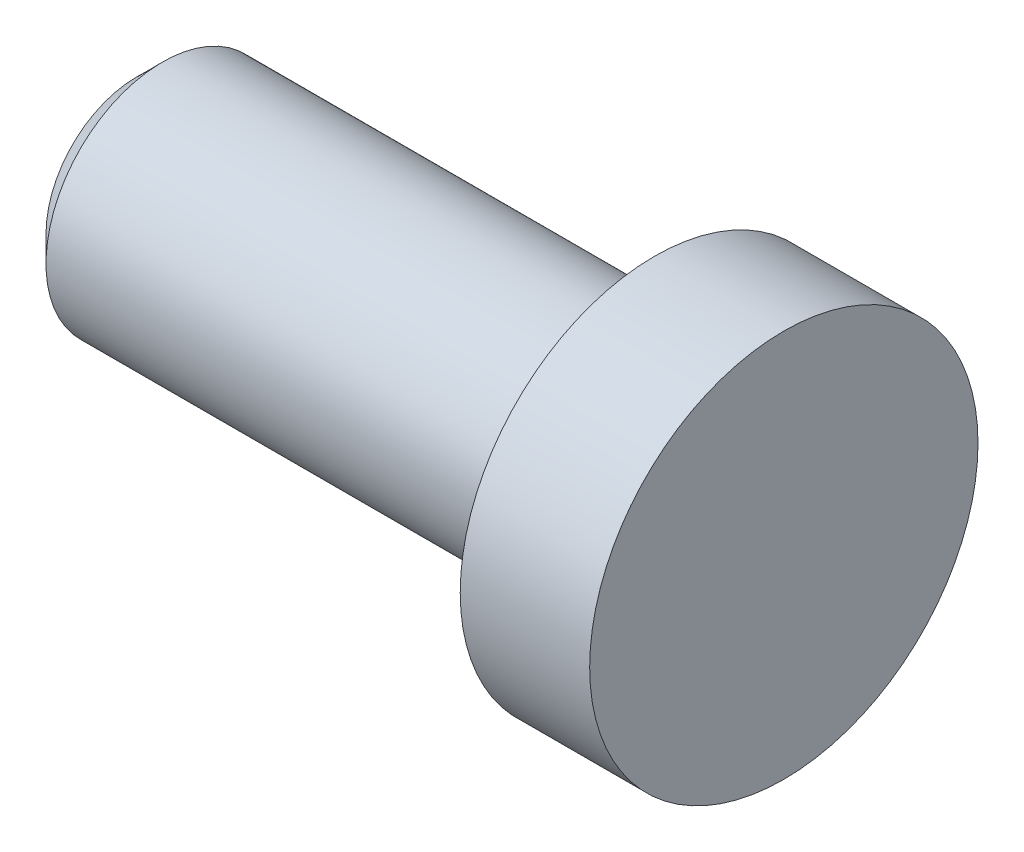
ISO-10303-21;
HEADER;
FILE_DESCRIPTION(('STEP AP214'),'2;1');
FILE_NAME('part.step','',(''),(''),'','','');
FILE_SCHEMA(('AUTOMOTIVE_DESIGN { 1 0 10303 214 1 1 1 1 }'));
ENDSEC;
DATA;
#1=APPLICATION_CONTEXT('core data for automotive mechanical design processes');
#2=APPLICATION_PROTOCOL_DEFINITION('international standard','automotive_design',2000,#1);
#3=PRODUCT_CONTEXT('',#1,'mechanical');
#4=PRODUCT('Part','Part','',(#3));
#5=PRODUCT_RELATED_PRODUCT_CATEGORY('part','',(#4));
#6=PRODUCT_DEFINITION_FORMATION('','',#4);
#7=PRODUCT_DEFINITION_CONTEXT('part definition',#1,'design');
#8=PRODUCT_DEFINITION('design','',#6,#7);
#9=PRODUCT_DEFINITION_SHAPE('','',#8);
#10=(LENGTH_UNIT() NAMED_UNIT(*) SI_UNIT(.MILLI.,.METRE.));
#11=(NAMED_UNIT(*) PLANE_ANGLE_UNIT() SI_UNIT($,.RADIAN.));
#12=(NAMED_UNIT(*) SI_UNIT($,.STERADIAN.) SOLID_ANGLE_UNIT());
#13=UNCERTAINTY_MEASURE_WITH_UNIT(LENGTH_MEASURE(1.E-05),#10,'distance_accuracy_value','');
#14=(GEOMETRIC_REPRESENTATION_CONTEXT(3) GLOBAL_UNCERTAINTY_ASSIGNED_CONTEXT((#13)) GLOBAL_UNIT_ASSIGNED_CONTEXT((#10,
#11,#12)) REPRESENTATION_CONTEXT('',''));
#15=CARTESIAN_POINT('',(0.,0.,0.));
#16=DIRECTION('',(0.,0.,1.));
#17=DIRECTION('',(1.,0.,0.));
#18=AXIS2_PLACEMENT_3D('',#15,#16,#17);
#19=CARTESIAN_POINT('',(-11.0000000000241,0.,0.));
#20=DIRECTION('',(-1.,0.,0.));
#21=DIRECTION('',(0.,0.,1.));
#22=AXIS2_PLACEMENT_3D('',#19,#20,#21);
#23=CONICAL_SURFACE('',#22,1.2499999999136,1.04719755103579);
#24=CARTESIAN_POINT('',(-11.,0.,0.));
#25=DIRECTION('',(-1.,0.,0.));
#26=DIRECTION('',(0.,0.,1.));
#27=AXIS2_PLACEMENT_3D('',#24,#25,#26);
#28=CIRCLE('',#27,1.25);
#29=CARTESIAN_POINT('',(-11.,0.,1.25));
#30=VERTEX_POINT('',#29);
#31=EDGE_CURVE('E89',#30,#30,#28,.T.);
#32=ORIENTED_EDGE('',*,*,#31,.T.);
#33=EDGE_LOOP('',(#32));
#34=FACE_BOUND('',#33,.T.);
#35=CARTESIAN_POINT('',(-10.2783121635071,1.98951966012828E-10,0.));
#36=VERTEX_POINT('',#35);
#37=VERTEX_LOOP('',#36);
#38=FACE_BOUND('',#37,.T.);
#39=ADVANCED_FACE('F16',(#34,#38),#23,.F.);
#40=CARTESIAN_POINT('',(-9.542227771689,0.,0.));
#41=DIRECTION('',(-1.,0.,0.));
#42=DIRECTION('',(0.,0.,1.));
#43=AXIS2_PLACEMENT_3D('',#40,#41,#42);
#44=CYLINDRICAL_SURFACE('',#43,1.25);
#45=CARTESIAN_POINT('',(-22.0500000000357,0.,0.));
#46=DIRECTION('',(-1.,0.,0.));
#47=DIRECTION('',(0.,1.,0.));
#48=AXIS2_PLACEMENT_3D('',#45,#46,#47);
#49=CIRCLE('',#48,1.25000000002728);
#50=CARTESIAN_POINT('',(-22.0500000000357,1.25000000002728,0.));
#51=VERTEX_POINT('',#50);
#52=EDGE_CURVE('E88',#51,#51,#49,.T.);
#53=ORIENTED_EDGE('',*,*,#52,.T.);
#54=EDGE_LOOP('',(#53));
#55=FACE_BOUND('',#54,.T.);
#56=ORIENTED_EDGE('',*,*,#31,.F.);
#57=EDGE_LOOP('',(#56));
#58=FACE_BOUND('',#57,.T.);
#59=ADVANCED_FACE('F28',(#55,#58),#44,.F.);
#60=CARTESIAN_POINT('',(-22.399999999891,0.,0.));
#61=DIRECTION('',(-1.,0.,0.));
#62=DIRECTION('',(0.,0.,1.));
#63=AXIS2_PLACEMENT_3D('',#60,#61,#62);
#64=CONICAL_SURFACE('',#63,1.59999999988258,0.785398163397448);
#65=CARTESIAN_POINT('',(-22.4,0.,0.));
#66=DIRECTION('',(-1.,0.,0.));
#67=DIRECTION('',(0.,0.,1.));
#68=AXIS2_PLACEMENT_3D('',#65,#66,#67);
#69=CIRCLE('',#68,1.6);
#70=CARTESIAN_POINT('',(-22.4,0.,1.6));
#71=VERTEX_POINT('',#70);
#72=EDGE_CURVE('E85',#71,#71,#69,.T.);
#73=ORIENTED_EDGE('',*,*,#72,.T.);
#74=EDGE_LOOP('',(#73));
#75=FACE_BOUND('',#74,.T.);
#76=ORIENTED_EDGE('',*,*,#52,.F.);
#77=EDGE_LOOP('',(#76));
#78=FACE_BOUND('',#77,.T.);
#79=ADVANCED_FACE('F34',(#75,#78),#64,.F.);
#80=CARTESIAN_POINT('',(-9.542227771689,0.,0.));
#81=DIRECTION('',(-1.,0.,0.));
#82=DIRECTION('',(0.,0.,1.));
#83=AXIS2_PLACEMENT_3D('',#80,#81,#82);
#84=CYLINDRICAL_SURFACE('',#83,1.6);
#85=CARTESIAN_POINT('',(-23.1999999999744,0.,0.));
#86=DIRECTION('',(-1.,0.,0.));
#87=DIRECTION('',(0.,1.,0.));
#88=AXIS2_PLACEMENT_3D('',#85,#86,#87);
#89=CIRCLE('',#88,1.59999999999627);
#90=CARTESIAN_POINT('',(-23.1999999999744,1.59999999999627,0.));
#91=VERTEX_POINT('',#90);
#92=EDGE_CURVE('E91',#91,#91,#89,.T.);
#93=ORIENTED_EDGE('',*,*,#92,.T.);
#94=EDGE_LOOP('',(#93));
#95=FACE_BOUND('',#94,.T.);
#96=ORIENTED_EDGE('',*,*,#72,.F.);
#97=EDGE_LOOP('',(#96));
#98=FACE_BOUND('',#97,.T.);
#99=ADVANCED_FACE('F73',(#95,#98),#84,.F.);
#100=CARTESIAN_POINT('',(-24.6999999999389,0.,0.));
#101=DIRECTION('',(-1.,0.,0.));
#102=DIRECTION('',(0.,0.,1.));
#103=AXIS2_PLACEMENT_3D('',#100,#101,#102);
#104=CONICAL_SURFACE('',#103,2.60038475767033,0.588180163018313);
#105=CARTESIAN_POINT('',(-24.6999999999957,0.,0.));
#106=DIRECTION('',(-1.,0.,0.));
#107=DIRECTION('',(0.,1.,0.));
#108=AXIS2_PLACEMENT_3D('',#105,#106,#107);
#109=CIRCLE('',#108,2.60038475767033);
#110=CARTESIAN_POINT('',(-24.6999999999957,2.60038475767033,0.));
#111=VERTEX_POINT('',#110);
#112=EDGE_CURVE('E107',#111,#111,#109,.T.);
#113=ORIENTED_EDGE('',*,*,#112,.T.);
#114=EDGE_LOOP('',(#113));
#115=FACE_BOUND('',#114,.T.);
#116=ORIENTED_EDGE('',*,*,#92,.F.);
#117=EDGE_LOOP('',(#116));
#118=FACE_BOUND('',#117,.T.);
#119=ADVANCED_FACE('F69',(#115,#118),#104,.F.);
#120=CARTESIAN_POINT('',(0.,0.,0.));
#121=DIRECTION('',(1.,0.,0.));
#122=DIRECTION('',(0.,0.,-1.));
#123=AXIS2_PLACEMENT_3D('',#120,#121,#122);
#124=PLANE('',#123);
#125=CARTESIAN_POINT('',(0.,0.,0.));
#126=DIRECTION('',(1.,0.,0.));
#127=DIRECTION('',(0.,0.,-1.));
#128=AXIS2_PLACEMENT_3D('',#125,#126,#127);
#129=CIRCLE('',#128,7.5);
#130=CARTESIAN_POINT('',(0.,0.,-7.5));
#131=VERTEX_POINT('',#130);
#132=EDGE_CURVE('E19',#131,#131,#129,.F.);
#133=ORIENTED_EDGE('',*,*,#132,.F.);
#134=EDGE_LOOP('',(#133));
#135=FACE_BOUND('',#134,.T.);
#136=ADVANCED_FACE('F65',(#135),#124,.T.);
#137=CARTESIAN_POINT('',(-24.9999999999204,0.,0.));
#138=DIRECTION('',(-1.,0.,0.));
#139=DIRECTION('',(0.,0.,1.));
#140=AXIS2_PLACEMENT_3D('',#137,#138,#139);
#141=CONICAL_SURFACE('',#140,3.11999999979662,1.047197551163);
#142=ORIENTED_EDGE('',*,*,#112,.F.);
#143=EDGE_LOOP('',(#142));
#144=FACE_BOUND('',#143,.T.);
#145=CARTESIAN_POINT('',(-25.0000000000517,0.,0.));
#146=DIRECTION('',(-1.,0.,0.));
#147=DIRECTION('',(0.,0.,1.));
#148=AXIS2_PLACEMENT_3D('',#145,#146,#147);
#149=CIRCLE('',#148,3.12000000002399);
#150=CARTESIAN_POINT('',(-25.0000000000517,0.,3.12000000002399));
#151=VERTEX_POINT('',#150);
#152=EDGE_CURVE('E102',#151,#151,#149,.T.);
#153=ORIENTED_EDGE('',*,*,#152,.T.);
#154=EDGE_LOOP('',(#153));
#155=FACE_BOUND('',#154,.T.);
#156=ADVANCED_FACE('F61',(#144,#155),#141,.F.);
#157=CARTESIAN_POINT('',(-26.25,0.,0.));
#158=DIRECTION('',(1.,0.,0.));
#159=DIRECTION('',(0.,0.,-1.));
#160=AXIS2_PLACEMENT_3D('',#157,#158,#159);
#161=CYLINDRICAL_SURFACE('',#160,7.5);
#162=CARTESIAN_POINT('',(-5.,0.,0.));
#163=DIRECTION('',(1.,0.,0.));
#164=DIRECTION('',(0.,0.,-1.));
#165=AXIS2_PLACEMENT_3D('',#162,#163,#164);
#166=CIRCLE('',#165,7.5);
#167=CARTESIAN_POINT('',(-5.,0.,-7.5));
#168=VERTEX_POINT('',#167);
#169=EDGE_CURVE('E100',#168,#168,#166,.T.);
#170=ORIENTED_EDGE('',*,*,#169,.T.);
#171=EDGE_LOOP('',(#170));
#172=FACE_BOUND('',#171,.T.);
#173=ORIENTED_EDGE('',*,*,#132,.T.);
#174=EDGE_LOOP('',(#173));
#175=FACE_BOUND('',#174,.T.);
#176=ADVANCED_FACE('F57',(#172,#175),#161,.T.);
#177=CARTESIAN_POINT('',(-25.,0.,0.));
#178=DIRECTION('',(1.,0.,0.));
#179=DIRECTION('',(0.,0.,-1.));
#180=AXIS2_PLACEMENT_3D('',#177,#178,#179);
#181=PLANE('',#180);
#182=ORIENTED_EDGE('',*,*,#152,.F.);
#183=EDGE_LOOP('',(#182));
#184=FACE_BOUND('',#183,.T.);
#185=CARTESIAN_POINT('',(-25.0000000000341,0.,0.));
#186=DIRECTION('',(1.,0.,0.));
#187=DIRECTION('',(0.,0.,-1.));
#188=AXIS2_PLACEMENT_3D('',#185,#186,#187);
#189=CIRCLE('',#188,3.49999999997408);
#190=CARTESIAN_POINT('',(-25.0000000000341,0.,-3.49999999997408));
#191=VERTEX_POINT('',#190);
#192=EDGE_CURVE('E97',#191,#191,#189,.T.);
#193=ORIENTED_EDGE('',*,*,#192,.F.);
#194=EDGE_LOOP('',(#193));
#195=FACE_BOUND('',#194,.T.);
#196=ADVANCED_FACE('F53',(#184,#195),#181,.F.);
#197=CARTESIAN_POINT('',(-5.,0.,0.));
#198=DIRECTION('',(1.,0.,0.));
#199=DIRECTION('',(0.,0.,-1.));
#200=AXIS2_PLACEMENT_3D('',#197,#198,#199);
#201=PLANE('',#200);
#202=CARTESIAN_POINT('',(-5.,0.,0.));
#203=DIRECTION('',(1.,0.,0.));
#204=DIRECTION('',(0.,0.,-1.));
#205=AXIS2_PLACEMENT_3D('',#202,#203,#204);
#206=CIRCLE('',#205,4.5);
#207=CARTESIAN_POINT('',(-5.,0.,-4.5));
#208=VERTEX_POINT('',#207);
#209=EDGE_CURVE('E23',#208,#208,#206,.F.);
#210=ORIENTED_EDGE('',*,*,#209,.F.);
#211=EDGE_LOOP('',(#210));
#212=FACE_BOUND('',#211,.T.);
#213=ORIENTED_EDGE('',*,*,#169,.F.);
#214=EDGE_LOOP('',(#213));
#215=FACE_BOUND('',#214,.T.);
#216=ADVANCED_FACE('F45',(#212,#215),#201,.F.);
#217=CARTESIAN_POINT('',(-24.0000000000578,0.,0.));
#218=DIRECTION('',(1.,0.,0.));
#219=DIRECTION('',(0.,0.,-1.));
#220=AXIS2_PLACEMENT_3D('',#217,#218,#219);
#221=CONICAL_SURFACE('',#220,4.50000000000728,0.78539816342587);
#222=CARTESIAN_POINT('',(-24.,0.,0.));
#223=DIRECTION('',(1.,0.,0.));
#224=DIRECTION('',(0.,0.,-1.));
#225=AXIS2_PLACEMENT_3D('',#222,#223,#224);
#226=CIRCLE('',#225,4.5);
#227=CARTESIAN_POINT('',(-24.,0.,-4.5));
#228=VERTEX_POINT('',#227);
#229=EDGE_CURVE('E11',#228,#228,#226,.T.);
#230=ORIENTED_EDGE('',*,*,#229,.F.);
#231=EDGE_LOOP('',(#230));
#232=FACE_BOUND('',#231,.T.);
#233=ORIENTED_EDGE('',*,*,#192,.T.);
#234=EDGE_LOOP('',(#233));
#235=FACE_BOUND('',#234,.T.);
#236=ADVANCED_FACE('F39',(#232,#235),#221,.T.);
#237=CARTESIAN_POINT('',(-26.25,0.,0.));
#238=DIRECTION('',(1.,0.,0.));
#239=DIRECTION('',(0.,0.,-1.));
#240=AXIS2_PLACEMENT_3D('',#237,#238,#239);
#241=CYLINDRICAL_SURFACE('',#240,4.5);
#242=ORIENTED_EDGE('',*,*,#209,.T.);
#243=EDGE_LOOP('',(#242));
#244=FACE_BOUND('',#243,.T.);
#245=ORIENTED_EDGE('',*,*,#229,.T.);
#246=EDGE_LOOP('',(#245));
#247=FACE_BOUND('',#246,.T.);
#248=ADVANCED_FACE('F37',(#244,#247),#241,.T.);
#249=CLOSED_SHELL('',(#39,#59,#79,#99,#119,#136,#156,#176,#196,#216,#236,#248));
#250=MANIFOLD_SOLID_BREP('B1',#249);
#251=ADVANCED_BREP_SHAPE_REPRESENTATION('',(#18,#250),#14);
#252=SHAPE_DEFINITION_REPRESENTATION(#9,#251);
ENDSEC;
END-ISO-10303-21;
